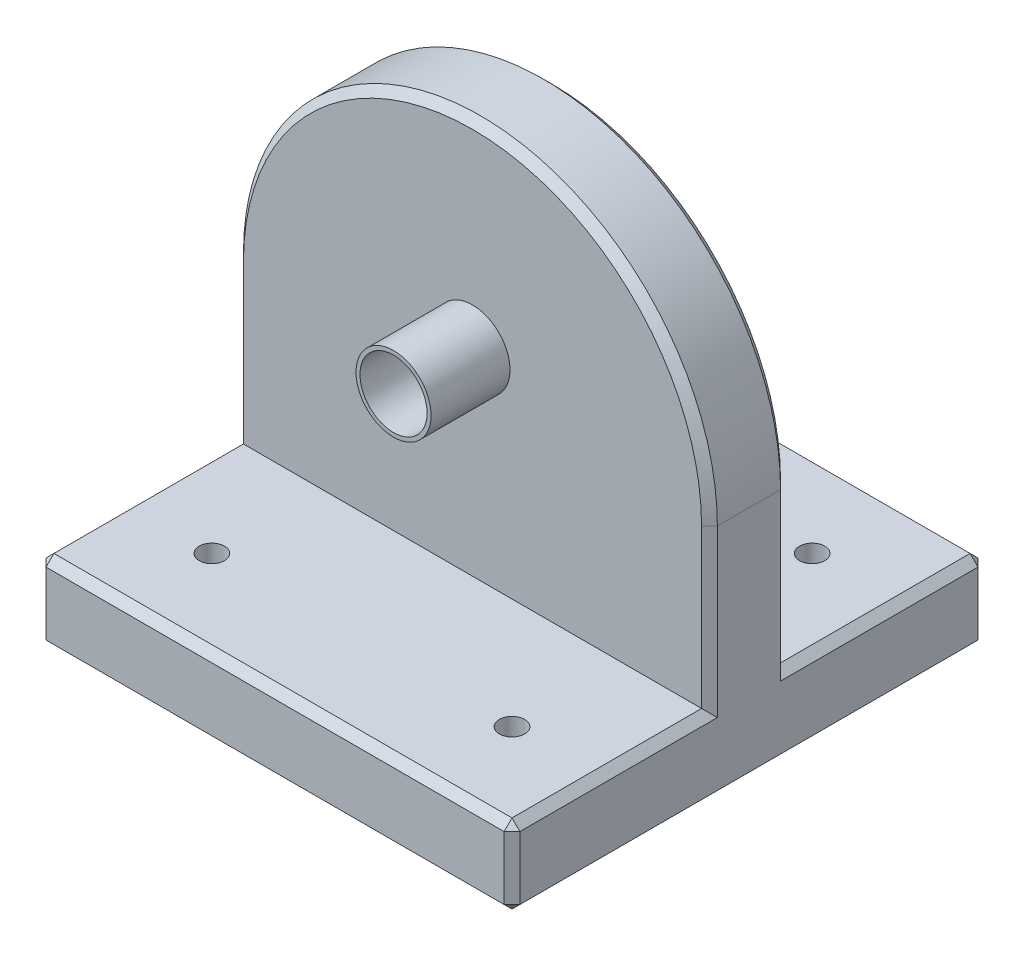
ISO-10303-21;
HEADER;
FILE_DESCRIPTION(('STEP AP214'),'2;1');
FILE_NAME('part.step','',(''),(''),'','','');
FILE_SCHEMA(('AUTOMOTIVE_DESIGN { 1 0 10303 214 1 1 1 1 }'));
ENDSEC;
DATA;
#1=APPLICATION_CONTEXT('core data for automotive mechanical design processes');
#2=APPLICATION_PROTOCOL_DEFINITION('international standard','automotive_design',2000,#1);
#3=PRODUCT_CONTEXT('',#1,'mechanical');
#4=PRODUCT('Part','Part','',(#3));
#5=PRODUCT_RELATED_PRODUCT_CATEGORY('part','',(#4));
#6=PRODUCT_DEFINITION_FORMATION('','',#4);
#7=PRODUCT_DEFINITION_CONTEXT('part definition',#1,'design');
#8=PRODUCT_DEFINITION('design','',#6,#7);
#9=PRODUCT_DEFINITION_SHAPE('','',#8);
#10=(LENGTH_UNIT() NAMED_UNIT(*) SI_UNIT(.MILLI.,.METRE.));
#11=(NAMED_UNIT(*) PLANE_ANGLE_UNIT() SI_UNIT($,.RADIAN.));
#12=(NAMED_UNIT(*) SI_UNIT($,.STERADIAN.) SOLID_ANGLE_UNIT());
#13=UNCERTAINTY_MEASURE_WITH_UNIT(LENGTH_MEASURE(1.E-05),#10,'distance_accuracy_value','');
#14=(GEOMETRIC_REPRESENTATION_CONTEXT(3) GLOBAL_UNCERTAINTY_ASSIGNED_CONTEXT((#13)) GLOBAL_UNIT_ASSIGNED_CONTEXT((#10,
#11,#12)) REPRESENTATION_CONTEXT('',''));
#15=CARTESIAN_POINT('',(0.,0.,0.));
#16=DIRECTION('',(0.,0.,1.));
#17=DIRECTION('',(1.,0.,0.));
#18=AXIS2_PLACEMENT_3D('',#15,#16,#17);
#19=CARTESIAN_POINT('',(0.,-5.,10.));
#20=DIRECTION('',(0.,0.,-1.));
#21=DIRECTION('',(-1.,0.,0.));
#22=AXIS2_PLACEMENT_3D('',#19,#20,#21);
#23=CYLINDRICAL_SURFACE('',#22,30.);
#24=DIRECTION('',(0.,0.,-1.));
#25=VECTOR('',#24,1.);
#26=CARTESIAN_POINT('',(30.,-5.,10.));
#27=LINE('',#26,#25);
#28=CARTESIAN_POINT('',(30.,-5.,1.00000000000001));
#29=VERTEX_POINT('',#28);
#30=CARTESIAN_POINT('',(30.,-5.,9.));
#31=VERTEX_POINT('',#30);
#32=EDGE_CURVE('E482',#29,#31,#27,.F.);
#33=ORIENTED_EDGE('',*,*,#32,.F.);
#34=CARTESIAN_POINT('',(0.,-5.,1.00000000000001));
#35=DIRECTION('',(0.,0.,-1.));
#36=DIRECTION('',(-1.,0.,0.));
#37=AXIS2_PLACEMENT_3D('',#34,#35,#36);
#38=CIRCLE('',#37,30.);
#39=CARTESIAN_POINT('',(-30.,-5.,1.00000000000001));
#40=VERTEX_POINT('',#39);
#41=EDGE_CURVE('E224',#29,#40,#38,.F.);
#42=ORIENTED_EDGE('',*,*,#41,.T.);
#43=DIRECTION('',(0.,0.,-1.));
#44=VECTOR('',#43,1.);
#45=CARTESIAN_POINT('',(-30.,-5.,10.));
#46=LINE('',#45,#44);
#47=CARTESIAN_POINT('',(-30.,-5.,9.));
#48=VERTEX_POINT('',#47);
#49=EDGE_CURVE('E478',#48,#40,#46,.T.);
#50=ORIENTED_EDGE('',*,*,#49,.F.);
#51=CARTESIAN_POINT('',(0.,-5.,9.));
#52=DIRECTION('',(0.,0.,-1.));
#53=DIRECTION('',(-1.,0.,0.));
#54=AXIS2_PLACEMENT_3D('',#51,#52,#53);
#55=CIRCLE('',#54,30.);
#56=EDGE_CURVE('E219',#48,#31,#55,.T.);
#57=ORIENTED_EDGE('',*,*,#56,.T.);
#58=EDGE_LOOP('',(#33,#42,#50,#57));
#59=FACE_BOUND('',#58,.T.);
#60=ADVANCED_FACE('F40',(#59),#23,.T.);
#61=CARTESIAN_POINT('',(0.,0.,10.));
#62=DIRECTION('',(0.,0.,-1.));
#63=DIRECTION('',(-1.,0.,0.));
#64=AXIS2_PLACEMENT_3D('',#61,#62,#63);
#65=PLANE('',#64);
#66=CARTESIAN_POINT('',(0.,-5.,10.));
#67=DIRECTION('',(0.,0.,-1.));
#68=DIRECTION('',(-1.,0.,0.));
#69=AXIS2_PLACEMENT_3D('',#66,#67,#68);
#70=CIRCLE('',#69,29.);
#71=CARTESIAN_POINT('',(29.,-5.,10.));
#72=VERTEX_POINT('',#71);
#73=CARTESIAN_POINT('',(-29.,-5.,10.));
#74=VERTEX_POINT('',#73);
#75=EDGE_CURVE('E235',#72,#74,#70,.F.);
#76=ORIENTED_EDGE('',*,*,#75,.T.);
#77=DIRECTION('',(0.,-1.,0.));
#78=VECTOR('',#77,1.);
#79=CARTESIAN_POINT('',(-29.,0.,10.));
#80=LINE('',#79,#78);
#81=CARTESIAN_POINT('',(-29.,-25.,10.));
#82=VERTEX_POINT('',#81);
#83=EDGE_CURVE('E239',#74,#82,#80,.T.);
#84=ORIENTED_EDGE('',*,*,#83,.T.);
#85=DIRECTION('',(1.,0.,0.));
#86=VECTOR('',#85,1.);
#87=CARTESIAN_POINT('',(-30.,-25.,10.));
#88=LINE('',#87,#86);
#89=CARTESIAN_POINT('',(29.,-25.,10.));
#90=VERTEX_POINT('',#89);
#91=EDGE_CURVE('E201',#82,#90,#88,.T.);
#92=ORIENTED_EDGE('',*,*,#91,.T.);
#93=DIRECTION('',(0.,1.,0.));
#94=VECTOR('',#93,1.);
#95=CARTESIAN_POINT('',(29.,0.,10.));
#96=LINE('',#95,#94);
#97=EDGE_CURVE('E232',#90,#72,#96,.T.);
#98=ORIENTED_EDGE('',*,*,#97,.T.);
#99=EDGE_LOOP('',(#76,#84,#92,#98));
#100=FACE_BOUND('',#99,.T.);
#101=CARTESIAN_POINT('',(0.,0.,10.));
#102=DIRECTION('',(0.,0.,-1.));
#103=DIRECTION('',(-1.,0.,0.));
#104=AXIS2_PLACEMENT_3D('',#101,#102,#103);
#105=CIRCLE('',#104,4.75);
#106=CARTESIAN_POINT('',(-4.75,0.,10.));
#107=VERTEX_POINT('',#106);
#108=EDGE_CURVE('E473',#107,#107,#105,.F.);
#109=ORIENTED_EDGE('',*,*,#108,.F.);
#110=EDGE_LOOP('',(#109));
#111=FACE_BOUND('',#110,.T.);
#112=ADVANCED_FACE('F572',(#100,#111),#65,.F.);
#113=CARTESIAN_POINT('',(30.,-25.,10.));
#114=DIRECTION('',(-1.,0.,0.));
#115=DIRECTION('',(0.,0.,1.));
#116=AXIS2_PLACEMENT_3D('',#113,#114,#115);
#117=PLANE('',#116);
#118=DIRECTION('',(0.,0.,1.));
#119=VECTOR('',#118,1.);
#120=CARTESIAN_POINT('',(30.,-26.,0.));
#121=LINE('',#120,#119);
#122=CARTESIAN_POINT('',(30.,-26.,-24.));
#123=VERTEX_POINT('',#122);
#124=CARTESIAN_POINT('',(30.,-26.,1.00000000000001));
#125=VERTEX_POINT('',#124);
#126=EDGE_CURVE('E316',#123,#125,#121,.T.);
#127=ORIENTED_EDGE('',*,*,#126,.T.);
#128=DIRECTION('',(0.,1.,0.));
#129=VECTOR('',#128,1.);
#130=CARTESIAN_POINT('',(30.,-5.,1.00000000000001));
#131=LINE('',#130,#129);
#132=EDGE_CURVE('E319',#125,#29,#131,.T.);
#133=ORIENTED_EDGE('',*,*,#132,.T.);
#134=ORIENTED_EDGE('',*,*,#32,.T.);
#135=DIRECTION('',(0.,-1.,0.));
#136=VECTOR('',#135,1.);
#137=CARTESIAN_POINT('',(30.,-25.,9.));
#138=LINE('',#137,#136);
#139=CARTESIAN_POINT('',(30.,-26.,9.));
#140=VERTEX_POINT('',#139);
#141=EDGE_CURVE('E307',#31,#140,#138,.T.);
#142=ORIENTED_EDGE('',*,*,#141,.T.);
#143=DIRECTION('',(0.,0.,1.));
#144=VECTOR('',#143,1.);
#145=CARTESIAN_POINT('',(30.,-26.,35.));
#146=LINE('',#145,#144);
#147=CARTESIAN_POINT('',(30.,-26.,34.));
#148=VERTEX_POINT('',#147);
#149=EDGE_CURVE('E304',#140,#148,#146,.T.);
#150=ORIENTED_EDGE('',*,*,#149,.T.);
#151=DIRECTION('',(0.,-1.,0.));
#152=VECTOR('',#151,1.);
#153=CARTESIAN_POINT('',(30.,-25.,34.));
#154=LINE('',#153,#152);
#155=CARTESIAN_POINT('',(30.,-34.,34.));
#156=VERTEX_POINT('',#155);
#157=EDGE_CURVE('E301',#148,#156,#154,.T.);
#158=ORIENTED_EDGE('',*,*,#157,.T.);
#159=DIRECTION('',(0.,0.,-1.));
#160=VECTOR('',#159,1.);
#161=CARTESIAN_POINT('',(30.,-34.,10.));
#162=LINE('',#161,#160);
#163=CARTESIAN_POINT('',(30.,-34.,-24.));
#164=VERTEX_POINT('',#163);
#165=EDGE_CURVE('E310',#156,#164,#162,.T.);
#166=ORIENTED_EDGE('',*,*,#165,.T.);
#167=DIRECTION('',(0.,1.,0.));
#168=VECTOR('',#167,1.);
#169=CARTESIAN_POINT('',(30.,-25.,-24.));
#170=LINE('',#169,#168);
#171=EDGE_CURVE('E313',#164,#123,#170,.T.);
#172=ORIENTED_EDGE('',*,*,#171,.T.);
#173=EDGE_LOOP('',(#127,#133,#134,#142,#150,#158,#166,#172));
#174=FACE_BOUND('',#173,.T.);
#175=ADVANCED_FACE('F488',(#174),#117,.F.);
#176=CARTESIAN_POINT('',(-30.,-25.,10.));
#177=DIRECTION('',(1.,0.,0.));
#178=DIRECTION('',(0.,0.,-1.));
#179=AXIS2_PLACEMENT_3D('',#176,#177,#178);
#180=PLANE('',#179);
#181=ORIENTED_EDGE('',*,*,#49,.T.);
#182=DIRECTION('',(0.,-1.,0.));
#183=VECTOR('',#182,1.);
#184=CARTESIAN_POINT('',(-30.,-25.,1.00000000000001));
#185=LINE('',#184,#183);
#186=CARTESIAN_POINT('',(-30.,-26.,1.00000000000001));
#187=VERTEX_POINT('',#186);
#188=EDGE_CURVE('E259',#40,#187,#185,.T.);
#189=ORIENTED_EDGE('',*,*,#188,.T.);
#190=DIRECTION('',(0.,0.,-1.));
#191=VECTOR('',#190,1.);
#192=CARTESIAN_POINT('',(-30.,-26.,-25.));
#193=LINE('',#192,#191);
#194=CARTESIAN_POINT('',(-30.,-26.,-24.));
#195=VERTEX_POINT('',#194);
#196=EDGE_CURVE('E208',#187,#195,#193,.T.);
#197=ORIENTED_EDGE('',*,*,#196,.T.);
#198=DIRECTION('',(0.,-1.,0.));
#199=VECTOR('',#198,1.);
#200=CARTESIAN_POINT('',(-30.,-25.,-24.));
#201=LINE('',#200,#199);
#202=CARTESIAN_POINT('',(-30.,-34.,-24.));
#203=VERTEX_POINT('',#202);
#204=EDGE_CURVE('E254',#195,#203,#201,.T.);
#205=ORIENTED_EDGE('',*,*,#204,.T.);
#206=DIRECTION('',(0.,0.,1.));
#207=VECTOR('',#206,1.);
#208=CARTESIAN_POINT('',(-30.,-34.,10.));
#209=LINE('',#208,#207);
#210=CARTESIAN_POINT('',(-30.,-34.,34.));
#211=VERTEX_POINT('',#210);
#212=EDGE_CURVE('E245',#203,#211,#209,.T.);
#213=ORIENTED_EDGE('',*,*,#212,.T.);
#214=DIRECTION('',(0.,1.,0.));
#215=VECTOR('',#214,1.);
#216=CARTESIAN_POINT('',(-30.,-25.,34.));
#217=LINE('',#216,#215);
#218=CARTESIAN_POINT('',(-30.,-26.,34.));
#219=VERTEX_POINT('',#218);
#220=EDGE_CURVE('E242',#211,#219,#217,.T.);
#221=ORIENTED_EDGE('',*,*,#220,.T.);
#222=DIRECTION('',(0.,0.,-1.));
#223=VECTOR('',#222,1.);
#224=CARTESIAN_POINT('',(-30.,-26.,10.));
#225=LINE('',#224,#223);
#226=CARTESIAN_POINT('',(-30.,-26.,9.));
#227=VERTEX_POINT('',#226);
#228=EDGE_CURVE('E248',#219,#227,#225,.T.);
#229=ORIENTED_EDGE('',*,*,#228,.T.);
#230=DIRECTION('',(0.,1.,0.));
#231=VECTOR('',#230,1.);
#232=CARTESIAN_POINT('',(-30.,-25.,9.));
#233=LINE('',#232,#231);
#234=EDGE_CURVE('E251',#227,#48,#233,.T.);
#235=ORIENTED_EDGE('',*,*,#234,.T.);
#236=EDGE_LOOP('',(#181,#189,#197,#205,#213,#221,#229,#235));
#237=FACE_BOUND('',#236,.T.);
#238=ADVANCED_FACE('F537',(#237),#180,.F.);
#239=CARTESIAN_POINT('',(0.,0.,0.));
#240=DIRECTION('',(0.,0.,-1.));
#241=DIRECTION('',(-1.,0.,0.));
#242=AXIS2_PLACEMENT_3D('',#239,#240,#241);
#243=PLANE('',#242);
#244=CARTESIAN_POINT('',(0.,0.,0.));
#245=DIRECTION('',(0.,0.,1.));
#246=DIRECTION('',(1.,0.,0.));
#247=AXIS2_PLACEMENT_3D('',#244,#245,#246);
#248=CIRCLE('',#247,4.);
#249=CARTESIAN_POINT('',(4.,0.,0.));
#250=VERTEX_POINT('',#249);
#251=EDGE_CURVE('E202',#250,#250,#248,.T.);
#252=ORIENTED_EDGE('',*,*,#251,.T.);
#253=EDGE_LOOP('',(#252));
#254=FACE_BOUND('',#253,.T.);
#255=DIRECTION('',(1.,0.,0.));
#256=VECTOR('',#255,1.);
#257=CARTESIAN_POINT('',(-30.,-25.,0.));
#258=LINE('',#257,#256);
#259=CARTESIAN_POINT('',(-29.,-25.,0.));
#260=VERTEX_POINT('',#259);
#261=CARTESIAN_POINT('',(29.,-25.,0.));
#262=VERTEX_POINT('',#261);
#263=EDGE_CURVE('E181',#260,#262,#258,.T.);
#264=ORIENTED_EDGE('',*,*,#263,.F.);
#265=DIRECTION('',(0.,1.,0.));
#266=VECTOR('',#265,1.);
#267=CARTESIAN_POINT('',(-29.,-5.,0.));
#268=LINE('',#267,#266);
#269=CARTESIAN_POINT('',(-29.,-5.,0.));
#270=VERTEX_POINT('',#269);
#271=EDGE_CURVE('E196',#260,#270,#268,.T.);
#272=ORIENTED_EDGE('',*,*,#271,.T.);
#273=CARTESIAN_POINT('',(0.,-5.,0.));
#274=DIRECTION('',(0.,0.,-1.));
#275=DIRECTION('',(-1.,0.,0.));
#276=AXIS2_PLACEMENT_3D('',#273,#274,#275);
#277=CIRCLE('',#276,29.);
#278=CARTESIAN_POINT('',(29.,-5.,0.));
#279=VERTEX_POINT('',#278);
#280=EDGE_CURVE('E220',#270,#279,#277,.T.);
#281=ORIENTED_EDGE('',*,*,#280,.T.);
#282=DIRECTION('',(0.,-1.,0.));
#283=VECTOR('',#282,1.);
#284=CARTESIAN_POINT('',(29.,-25.,0.));
#285=LINE('',#284,#283);
#286=EDGE_CURVE('E199',#279,#262,#285,.T.);
#287=ORIENTED_EDGE('',*,*,#286,.T.);
#288=EDGE_LOOP('',(#264,#272,#281,#287));
#289=FACE_BOUND('',#288,.T.);
#290=ADVANCED_FACE('F193',(#254,#289),#243,.T.);
#291=CARTESIAN_POINT('',(0.,0.,10.));
#292=DIRECTION('',(0.,0.,1.));
#293=DIRECTION('',(1.,0.,0.));
#294=AXIS2_PLACEMENT_3D('',#291,#292,#293);
#295=CYLINDRICAL_SURFACE('',#294,4.);
#296=ORIENTED_EDGE('',*,*,#251,.F.);
#297=EDGE_LOOP('',(#296));
#298=FACE_BOUND('',#297,.T.);
#299=CARTESIAN_POINT('',(0.,0.,9.39644660940674));
#300=DIRECTION('',(0.,0.,1.));
#301=DIRECTION('',(1.,0.,0.));
#302=AXIS2_PLACEMENT_3D('',#299,#300,#301);
#303=CIRCLE('',#302,4.);
#304=CARTESIAN_POINT('',(4.,0.,9.39644660940674));
#305=VERTEX_POINT('',#304);
#306=EDGE_CURVE('E464',#305,#305,#303,.T.);
#307=ORIENTED_EDGE('',*,*,#306,.T.);
#308=EDGE_LOOP('',(#307));
#309=FACE_BOUND('',#308,.T.);
#310=ADVANCED_FACE('F768',(#298,#309),#295,.F.);
#311=CARTESIAN_POINT('',(0.,0.,10.));
#312=DIRECTION('',(0.,0.,1.));
#313=DIRECTION('',(1.,0.,0.));
#314=AXIS2_PLACEMENT_3D('',#311,#312,#313);
#315=CONICAL_SURFACE('',#314,4.25,0.392699081698732);
#316=ORIENTED_EDGE('',*,*,#306,.F.);
#317=EDGE_LOOP('',(#316));
#318=FACE_BOUND('',#317,.T.);
#319=CARTESIAN_POINT('',(0.,0.,10.));
#320=DIRECTION('',(0.,0.,1.));
#321=DIRECTION('',(1.,0.,0.));
#322=AXIS2_PLACEMENT_3D('',#319,#320,#321);
#323=CIRCLE('',#322,4.25);
#324=CARTESIAN_POINT('',(4.25,0.,10.));
#325=VERTEX_POINT('',#324);
#326=EDGE_CURVE('E445',#325,#325,#323,.T.);
#327=ORIENTED_EDGE('',*,*,#326,.T.);
#328=EDGE_LOOP('',(#327));
#329=FACE_BOUND('',#328,.T.);
#330=ADVANCED_FACE('F765',(#318,#329),#315,.F.);
#331=CARTESIAN_POINT('',(0.,-25.,0.));
#332=DIRECTION('',(0.,1.,0.));
#333=DIRECTION('',(0.,0.,1.));
#334=AXIS2_PLACEMENT_3D('',#331,#332,#333);
#335=PLANE('',#334);
#336=CARTESIAN_POINT('',(19.,-25.,24.));
#337=DIRECTION('',(0.,1.,0.));
#338=DIRECTION('',(0.,0.,1.));
#339=AXIS2_PLACEMENT_3D('',#336,#337,#338);
#340=CIRCLE('',#339,1.60000000000001);
#341=CARTESIAN_POINT('',(19.,-25.,25.6));
#342=VERTEX_POINT('',#341);
#343=EDGE_CURVE('E1084',#342,#342,#340,.T.);
#344=ORIENTED_EDGE('',*,*,#343,.F.);
#345=EDGE_LOOP('',(#344));
#346=FACE_BOUND('',#345,.T.);
#347=CARTESIAN_POINT('',(-19.,-25.,24.));
#348=DIRECTION('',(0.,1.,0.));
#349=DIRECTION('',(0.,0.,1.));
#350=AXIS2_PLACEMENT_3D('',#347,#348,#349);
#351=CIRCLE('',#350,1.60000000000001);
#352=CARTESIAN_POINT('',(-19.,-25.,25.6));
#353=VERTEX_POINT('',#352);
#354=EDGE_CURVE('E1092',#353,#353,#351,.T.);
#355=ORIENTED_EDGE('',*,*,#354,.F.);
#356=EDGE_LOOP('',(#355));
#357=FACE_BOUND('',#356,.T.);
#358=ORIENTED_EDGE('',*,*,#91,.F.);
#359=DIRECTION('',(0.,0.,1.));
#360=VECTOR('',#359,1.);
#361=CARTESIAN_POINT('',(-29.,-25.,35.));
#362=LINE('',#361,#360);
#363=CARTESIAN_POINT('',(-29.,-25.,34.));
#364=VERTEX_POINT('',#363);
#365=EDGE_CURVE('E268',#82,#364,#362,.T.);
#366=ORIENTED_EDGE('',*,*,#365,.T.);
#367=DIRECTION('',(1.,0.,0.));
#368=VECTOR('',#367,1.);
#369=CARTESIAN_POINT('',(30.,-25.,34.));
#370=LINE('',#369,#368);
#371=CARTESIAN_POINT('',(29.,-25.,34.));
#372=VERTEX_POINT('',#371);
#373=EDGE_CURVE('E262',#364,#372,#370,.T.);
#374=ORIENTED_EDGE('',*,*,#373,.T.);
#375=DIRECTION('',(0.,0.,-1.));
#376=VECTOR('',#375,1.);
#377=CARTESIAN_POINT('',(29.,-25.,10.));
#378=LINE('',#377,#376);
#379=EDGE_CURVE('E265',#372,#90,#378,.T.);
#380=ORIENTED_EDGE('',*,*,#379,.T.);
#381=EDGE_LOOP('',(#358,#366,#374,#380));
#382=FACE_BOUND('',#381,.T.);
#383=ADVANCED_FACE('F548',(#346,#357,#382),#335,.T.);
#384=CARTESIAN_POINT('',(-30.,-35.,35.));
#385=DIRECTION('',(0.,0.,-1.));
#386=DIRECTION('',(-1.,0.,0.));
#387=AXIS2_PLACEMENT_3D('',#384,#385,#386);
#388=PLANE('',#387);
#389=DIRECTION('',(1.,0.,0.));
#390=VECTOR('',#389,1.);
#391=CARTESIAN_POINT('',(-30.,-34.,35.));
#392=LINE('',#391,#390);
#393=CARTESIAN_POINT('',(-29.,-34.,35.));
#394=VERTEX_POINT('',#393);
#395=CARTESIAN_POINT('',(29.,-34.,35.));
#396=VERTEX_POINT('',#395);
#397=EDGE_CURVE('E51',#394,#396,#392,.T.);
#398=ORIENTED_EDGE('',*,*,#397,.T.);
#399=DIRECTION('',(0.,1.,0.));
#400=VECTOR('',#399,1.);
#401=CARTESIAN_POINT('',(29.,-35.,35.));
#402=LINE('',#401,#400);
#403=CARTESIAN_POINT('',(29.,-26.,35.));
#404=VERTEX_POINT('',#403);
#405=EDGE_CURVE('E11',#396,#404,#402,.T.);
#406=ORIENTED_EDGE('',*,*,#405,.T.);
#407=DIRECTION('',(-1.,0.,0.));
#408=VECTOR('',#407,1.);
#409=CARTESIAN_POINT('',(-30.,-26.,35.));
#410=LINE('',#409,#408);
#411=CARTESIAN_POINT('',(-29.,-26.,35.));
#412=VERTEX_POINT('',#411);
#413=EDGE_CURVE('E322',#404,#412,#410,.T.);
#414=ORIENTED_EDGE('',*,*,#413,.T.);
#415=DIRECTION('',(0.,-1.,0.));
#416=VECTOR('',#415,1.);
#417=CARTESIAN_POINT('',(-29.,-35.,35.));
#418=LINE('',#417,#416);
#419=EDGE_CURVE('E62',#412,#394,#418,.T.);
#420=ORIENTED_EDGE('',*,*,#419,.T.);
#421=EDGE_LOOP('',(#398,#406,#414,#420));
#422=FACE_BOUND('',#421,.T.);
#423=ADVANCED_FACE('F761',(#422),#388,.F.);
#424=CARTESIAN_POINT('',(-30.,-35.,-25.));
#425=DIRECTION('',(0.,0.,1.));
#426=DIRECTION('',(1.,0.,0.));
#427=AXIS2_PLACEMENT_3D('',#424,#425,#426);
#428=PLANE('',#427);
#429=DIRECTION('',(-1.,0.,0.));
#430=VECTOR('',#429,1.);
#431=CARTESIAN_POINT('',(-30.,-34.,-25.));
#432=LINE('',#431,#430);
#433=CARTESIAN_POINT('',(29.,-34.,-25.));
#434=VERTEX_POINT('',#433);
#435=CARTESIAN_POINT('',(-29.,-34.,-25.));
#436=VERTEX_POINT('',#435);
#437=EDGE_CURVE('E294',#434,#436,#432,.T.);
#438=ORIENTED_EDGE('',*,*,#437,.T.);
#439=DIRECTION('',(0.,1.,0.));
#440=VECTOR('',#439,1.);
#441=CARTESIAN_POINT('',(-29.,-35.,-25.));
#442=LINE('',#441,#440);
#443=CARTESIAN_POINT('',(-29.,-26.,-25.));
#444=VERTEX_POINT('',#443);
#445=EDGE_CURVE('E297',#436,#444,#442,.T.);
#446=ORIENTED_EDGE('',*,*,#445,.T.);
#447=DIRECTION('',(1.,0.,0.));
#448=VECTOR('',#447,1.);
#449=CARTESIAN_POINT('',(30.,-26.,-25.));
#450=LINE('',#449,#448);
#451=CARTESIAN_POINT('',(29.,-26.,-25.));
#452=VERTEX_POINT('',#451);
#453=EDGE_CURVE('E291',#444,#452,#450,.T.);
#454=ORIENTED_EDGE('',*,*,#453,.T.);
#455=DIRECTION('',(0.,-1.,0.));
#456=VECTOR('',#455,1.);
#457=CARTESIAN_POINT('',(29.,-35.,-25.));
#458=LINE('',#457,#456);
#459=EDGE_CURVE('E190',#452,#434,#458,.T.);
#460=ORIENTED_EDGE('',*,*,#459,.T.);
#461=EDGE_LOOP('',(#438,#446,#454,#460));
#462=FACE_BOUND('',#461,.T.);
#463=ADVANCED_FACE('F754',(#462),#428,.F.);
#464=CARTESIAN_POINT('',(0.,-35.,0.));
#465=DIRECTION('',(0.,1.,0.));
#466=DIRECTION('',(0.,0.,1.));
#467=AXIS2_PLACEMENT_3D('',#464,#465,#466);
#468=PLANE('',#467);
#469=CARTESIAN_POINT('',(-19.,-35.,-14.));
#470=DIRECTION('',(0.,1.,0.));
#471=DIRECTION('',(0.,0.,1.));
#472=AXIS2_PLACEMENT_3D('',#469,#470,#471);
#473=CIRCLE('',#472,1.60000000000001);
#474=CARTESIAN_POINT('',(-19.,-35.,-12.4));
#475=VERTEX_POINT('',#474);
#476=EDGE_CURVE('E1067',#475,#475,#473,.T.);
#477=ORIENTED_EDGE('',*,*,#476,.T.);
#478=EDGE_LOOP('',(#477));
#479=FACE_BOUND('',#478,.T.);
#480=CARTESIAN_POINT('',(19.,-35.,-14.));
#481=DIRECTION('',(0.,1.,0.));
#482=DIRECTION('',(0.,0.,1.));
#483=AXIS2_PLACEMENT_3D('',#480,#481,#482);
#484=CIRCLE('',#483,1.60000000000001);
#485=CARTESIAN_POINT('',(19.,-35.,-12.4));
#486=VERTEX_POINT('',#485);
#487=EDGE_CURVE('E1080',#486,#486,#484,.T.);
#488=ORIENTED_EDGE('',*,*,#487,.T.);
#489=EDGE_LOOP('',(#488));
#490=FACE_BOUND('',#489,.T.);
#491=CARTESIAN_POINT('',(19.,-35.,24.));
#492=DIRECTION('',(0.,1.,0.));
#493=DIRECTION('',(0.,0.,1.));
#494=AXIS2_PLACEMENT_3D('',#491,#492,#493);
#495=CIRCLE('',#494,1.60000000000001);
#496=CARTESIAN_POINT('',(19.,-35.,25.6));
#497=VERTEX_POINT('',#496);
#498=EDGE_CURVE('E1088',#497,#497,#495,.T.);
#499=ORIENTED_EDGE('',*,*,#498,.T.);
#500=EDGE_LOOP('',(#499));
#501=FACE_BOUND('',#500,.T.);
#502=CARTESIAN_POINT('',(-19.,-35.,24.));
#503=DIRECTION('',(0.,1.,0.));
#504=DIRECTION('',(0.,0.,1.));
#505=AXIS2_PLACEMENT_3D('',#502,#503,#504);
#506=CIRCLE('',#505,1.60000000000001);
#507=CARTESIAN_POINT('',(-19.,-35.,25.6));
#508=VERTEX_POINT('',#507);
#509=EDGE_CURVE('E332',#508,#508,#506,.T.);
#510=ORIENTED_EDGE('',*,*,#509,.T.);
#511=EDGE_LOOP('',(#510));
#512=FACE_BOUND('',#511,.T.);
#513=DIRECTION('',(-1.,0.,0.));
#514=VECTOR('',#513,1.);
#515=CARTESIAN_POINT('',(0.,-35.,34.));
#516=LINE('',#515,#514);
#517=CARTESIAN_POINT('',(29.,-35.,34.));
#518=VERTEX_POINT('',#517);
#519=CARTESIAN_POINT('',(-29.,-35.,34.));
#520=VERTEX_POINT('',#519);
#521=EDGE_CURVE('E271',#518,#520,#516,.T.);
#522=ORIENTED_EDGE('',*,*,#521,.T.);
#523=DIRECTION('',(0.,0.,-1.));
#524=VECTOR('',#523,1.);
#525=CARTESIAN_POINT('',(-29.,-35.,0.));
#526=LINE('',#525,#524);
#527=CARTESIAN_POINT('',(-29.,-35.,-24.));
#528=VERTEX_POINT('',#527);
#529=EDGE_CURVE('E280',#520,#528,#526,.T.);
#530=ORIENTED_EDGE('',*,*,#529,.T.);
#531=DIRECTION('',(1.,0.,0.));
#532=VECTOR('',#531,1.);
#533=CARTESIAN_POINT('',(0.,-35.,-24.));
#534=LINE('',#533,#532);
#535=CARTESIAN_POINT('',(29.,-35.,-24.));
#536=VERTEX_POINT('',#535);
#537=EDGE_CURVE('E277',#528,#536,#534,.T.);
#538=ORIENTED_EDGE('',*,*,#537,.T.);
#539=DIRECTION('',(0.,0.,1.));
#540=VECTOR('',#539,1.);
#541=CARTESIAN_POINT('',(29.,-35.,0.));
#542=LINE('',#541,#540);
#543=EDGE_CURVE('E274',#536,#518,#542,.T.);
#544=ORIENTED_EDGE('',*,*,#543,.T.);
#545=EDGE_LOOP('',(#522,#530,#538,#544));
#546=FACE_BOUND('',#545,.T.);
#547=ADVANCED_FACE('F751',(#479,#490,#501,#512,#546),#468,.F.);
#548=CARTESIAN_POINT('',(-19.,-25.,-14.));
#549=DIRECTION('',(0.,1.,0.));
#550=DIRECTION('',(0.,0.,1.));
#551=AXIS2_PLACEMENT_3D('',#548,#549,#550);
#552=CIRCLE('',#551,1.60000000000001);
#553=CARTESIAN_POINT('',(-19.,-25.,-12.4));
#554=VERTEX_POINT('',#553);
#555=EDGE_CURVE('E1070',#554,#554,#552,.T.);
#556=ORIENTED_EDGE('',*,*,#555,.F.);
#557=EDGE_LOOP('',(#556));
#558=FACE_BOUND('',#557,.T.);
#559=CARTESIAN_POINT('',(19.,-25.,-14.));
#560=DIRECTION('',(0.,1.,0.));
#561=DIRECTION('',(0.,0.,1.));
#562=AXIS2_PLACEMENT_3D('',#559,#560,#561);
#563=CIRCLE('',#562,1.60000000000001);
#564=CARTESIAN_POINT('',(19.,-25.,-12.4));
#565=VERTEX_POINT('',#564);
#566=EDGE_CURVE('E1074',#565,#565,#563,.T.);
#567=ORIENTED_EDGE('',*,*,#566,.F.);
#568=EDGE_LOOP('',(#567));
#569=FACE_BOUND('',#568,.T.);
#570=DIRECTION('',(-1.,0.,0.));
#571=VECTOR('',#570,1.);
#572=CARTESIAN_POINT('',(-30.,-25.,-24.));
#573=LINE('',#572,#571);
#574=CARTESIAN_POINT('',(29.,-25.,-24.));
#575=VERTEX_POINT('',#574);
#576=CARTESIAN_POINT('',(-29.,-25.,-24.));
#577=VERTEX_POINT('',#576);
#578=EDGE_CURVE('E184',#575,#577,#573,.T.);
#579=ORIENTED_EDGE('',*,*,#578,.T.);
#580=DIRECTION('',(0.,0.,1.));
#581=VECTOR('',#580,1.);
#582=CARTESIAN_POINT('',(-29.,-25.,0.));
#583=LINE('',#582,#581);
#584=EDGE_CURVE('E178',#577,#260,#583,.T.);
#585=ORIENTED_EDGE('',*,*,#584,.T.);
#586=ORIENTED_EDGE('',*,*,#263,.T.);
#587=DIRECTION('',(0.,0.,-1.));
#588=VECTOR('',#587,1.);
#589=CARTESIAN_POINT('',(29.,-25.,-25.));
#590=LINE('',#589,#588);
#591=EDGE_CURVE('E284',#262,#575,#590,.T.);
#592=ORIENTED_EDGE('',*,*,#591,.T.);
#593=EDGE_LOOP('',(#579,#585,#586,#592));
#594=FACE_BOUND('',#593,.T.);
#595=ADVANCED_FACE('F180',(#558,#569,#594),#335,.T.);
#596=CARTESIAN_POINT('',(0.,0.,20.));
#597=DIRECTION('',(0.,0.,1.));
#598=DIRECTION('',(1.,0.,0.));
#599=AXIS2_PLACEMENT_3D('',#596,#597,#598);
#600=PLANE('',#599);
#601=CARTESIAN_POINT('',(0.,0.,20.));
#602=DIRECTION('',(0.,0.,1.));
#603=DIRECTION('',(1.,0.,0.));
#604=AXIS2_PLACEMENT_3D('',#601,#602,#603);
#605=CIRCLE('',#604,4.75);
#606=CARTESIAN_POINT('',(4.75,0.,20.));
#607=VERTEX_POINT('',#606);
#608=EDGE_CURVE('E457',#607,#607,#605,.T.);
#609=ORIENTED_EDGE('',*,*,#608,.T.);
#610=EDGE_LOOP('',(#609));
#611=FACE_BOUND('',#610,.T.);
#612=CARTESIAN_POINT('',(0.,0.,20.));
#613=DIRECTION('',(0.,0.,1.));
#614=DIRECTION('',(1.,0.,0.));
#615=AXIS2_PLACEMENT_3D('',#612,#613,#614);
#616=CIRCLE('',#615,4.25);
#617=CARTESIAN_POINT('',(4.25,0.,20.));
#618=VERTEX_POINT('',#617);
#619=EDGE_CURVE('E451',#618,#618,#616,.T.);
#620=ORIENTED_EDGE('',*,*,#619,.F.);
#621=EDGE_LOOP('',(#620));
#622=FACE_BOUND('',#621,.T.);
#623=ADVANCED_FACE('F741',(#611,#622),#600,.T.);
#624=CARTESIAN_POINT('',(0.,0.,20.));
#625=DIRECTION('',(0.,0.,-1.));
#626=DIRECTION('',(-1.,0.,0.));
#627=AXIS2_PLACEMENT_3D('',#624,#625,#626);
#628=CYLINDRICAL_SURFACE('',#627,4.75);
#629=ORIENTED_EDGE('',*,*,#608,.F.);
#630=EDGE_LOOP('',(#629));
#631=FACE_BOUND('',#630,.T.);
#632=ORIENTED_EDGE('',*,*,#108,.T.);
#633=EDGE_LOOP('',(#632));
#634=FACE_BOUND('',#633,.T.);
#635=ADVANCED_FACE('F735',(#631,#634),#628,.T.);
#636=CARTESIAN_POINT('',(0.,0.,20.));
#637=DIRECTION('',(0.,0.,-1.));
#638=DIRECTION('',(-1.,0.,0.));
#639=AXIS2_PLACEMENT_3D('',#636,#637,#638);
#640=CYLINDRICAL_SURFACE('',#639,4.25);
#641=ORIENTED_EDGE('',*,*,#619,.T.);
#642=EDGE_LOOP('',(#641));
#643=FACE_BOUND('',#642,.T.);
#644=ORIENTED_EDGE('',*,*,#326,.F.);
#645=EDGE_LOOP('',(#644));
#646=FACE_BOUND('',#645,.T.);
#647=ADVANCED_FACE('F731',(#643,#646),#640,.F.);
#648=CARTESIAN_POINT('',(0.,-5.,10.));
#649=DIRECTION('',(0.,0.,-1.));
#650=DIRECTION('',(-1.,0.,0.));
#651=AXIS2_PLACEMENT_3D('',#648,#649,#650);
#652=CONICAL_SURFACE('',#651,29.,0.785398163397455);
#653=DIRECTION('',(-0.707106781186552,0.,0.707106781186542));
#654=VECTOR('',#653,1.);
#655=CARTESIAN_POINT('',(30.,-5.,9.));
#656=LINE('',#655,#654);
#657=EDGE_CURVE('E436',#31,#72,#656,.T.);
#658=ORIENTED_EDGE('',*,*,#657,.F.);
#659=ORIENTED_EDGE('',*,*,#56,.F.);
#660=DIRECTION('',(-0.707106781186552,0.,-0.707106781186542));
#661=VECTOR('',#660,1.);
#662=CARTESIAN_POINT('',(-29.,-5.,10.));
#663=LINE('',#662,#661);
#664=EDGE_CURVE('E45',#74,#48,#663,.T.);
#665=ORIENTED_EDGE('',*,*,#664,.F.);
#666=ORIENTED_EDGE('',*,*,#75,.F.);
#667=EDGE_LOOP('',(#658,#659,#665,#666));
#668=FACE_BOUND('',#667,.T.);
#669=ADVANCED_FACE('F43',(#668),#652,.T.);
#670=CARTESIAN_POINT('',(-29.,0.,10.));
#671=DIRECTION('',(0.707106781186542,0.,-0.707106781186552));
#672=DIRECTION('',(0.,-1.,0.));
#673=AXIS2_PLACEMENT_3D('',#670,#671,#672);
#674=PLANE('',#673);
#675=ORIENTED_EDGE('',*,*,#664,.T.);
#676=ORIENTED_EDGE('',*,*,#234,.F.);
#677=DIRECTION('',(0.577350269189626,0.577350269189634,0.577350269189618));
#678=VECTOR('',#677,1.);
#679=CARTESIAN_POINT('',(-20.6666666666665,-16.6666666666664,18.3333333333333));
#680=LINE('',#679,#678);
#681=EDGE_CURVE('E433',#82,#227,#680,.F.);
#682=ORIENTED_EDGE('',*,*,#681,.F.);
#683=ORIENTED_EDGE('',*,*,#83,.F.);
#684=EDGE_LOOP('',(#675,#676,#682,#683));
#685=FACE_BOUND('',#684,.T.);
#686=ADVANCED_FACE('F540',(#685),#674,.F.);
#687=CARTESIAN_POINT('',(29.,0.,10.));
#688=DIRECTION('',(-0.707106781186542,0.,-0.707106781186552));
#689=DIRECTION('',(0.,1.,0.));
#690=AXIS2_PLACEMENT_3D('',#687,#688,#689);
#691=PLANE('',#690);
#692=ORIENTED_EDGE('',*,*,#657,.T.);
#693=ORIENTED_EDGE('',*,*,#97,.F.);
#694=DIRECTION('',(0.577350269189626,-0.577350269189634,-0.577350269189618));
#695=VECTOR('',#694,1.);
#696=CARTESIAN_POINT('',(20.6666666666665,-16.6666666666664,18.3333333333333));
#697=LINE('',#696,#695);
#698=EDGE_CURVE('E429',#140,#90,#697,.F.);
#699=ORIENTED_EDGE('',*,*,#698,.F.);
#700=ORIENTED_EDGE('',*,*,#141,.F.);
#701=EDGE_LOOP('',(#692,#693,#699,#700));
#702=FACE_BOUND('',#701,.T.);
#703=ADVANCED_FACE('F496',(#702),#691,.F.);
#704=CARTESIAN_POINT('',(-30.,-26.,10.));
#705=DIRECTION('',(-0.707106781186552,0.707106781186542,0.));
#706=DIRECTION('',(0.,0.,1.));
#707=AXIS2_PLACEMENT_3D('',#704,#705,#706);
#708=PLANE('',#707);
#709=ORIENTED_EDGE('',*,*,#681,.T.);
#710=ORIENTED_EDGE('',*,*,#228,.F.);
#711=DIRECTION('',(-0.707106781186543,-0.707106781186552,0.));
#712=VECTOR('',#711,1.);
#713=CARTESIAN_POINT('',(-29.,-25.,34.));
#714=LINE('',#713,#712);
#715=EDGE_CURVE('E425',#364,#219,#714,.T.);
#716=ORIENTED_EDGE('',*,*,#715,.F.);
#717=ORIENTED_EDGE('',*,*,#365,.F.);
#718=EDGE_LOOP('',(#709,#710,#716,#717));
#719=FACE_BOUND('',#718,.T.);
#720=ADVANCED_FACE('F543',(#719),#708,.T.);
#721=CARTESIAN_POINT('',(-30.,-26.,35.));
#722=DIRECTION('',(0.,0.707106781186542,0.707106781186552));
#723=DIRECTION('',(1.,0.,0.));
#724=AXIS2_PLACEMENT_3D('',#721,#722,#723);
#725=PLANE('',#724);
#726=DIRECTION('',(0.,-0.707106781186552,0.707106781186543));
#727=VECTOR('',#726,1.);
#728=CARTESIAN_POINT('',(29.,-25.5,34.5));
#729=LINE('',#728,#727);
#730=EDGE_CURVE('E417',#372,#404,#729,.T.);
#731=ORIENTED_EDGE('',*,*,#730,.F.);
#732=ORIENTED_EDGE('',*,*,#373,.F.);
#733=DIRECTION('',(0.,0.707106781186552,-0.707106781186543));
#734=VECTOR('',#733,1.);
#735=CARTESIAN_POINT('',(-29.,-25.,34.));
#736=LINE('',#735,#734);
#737=EDGE_CURVE('E421',#412,#364,#736,.T.);
#738=ORIENTED_EDGE('',*,*,#737,.F.);
#739=ORIENTED_EDGE('',*,*,#413,.F.);
#740=EDGE_LOOP('',(#731,#732,#738,#739));
#741=FACE_BOUND('',#740,.T.);
#742=ADVANCED_FACE('F552',(#741),#725,.T.);
#743=CARTESIAN_POINT('',(30.,-26.,10.));
#744=DIRECTION('',(0.707106781186552,0.707106781186542,0.));
#745=DIRECTION('',(0.,0.,-1.));
#746=AXIS2_PLACEMENT_3D('',#743,#744,#745);
#747=PLANE('',#746);
#748=ORIENTED_EDGE('',*,*,#698,.T.);
#749=ORIENTED_EDGE('',*,*,#379,.F.);
#750=DIRECTION('',(-0.707106781186543,0.707106781186552,0.));
#751=VECTOR('',#750,1.);
#752=CARTESIAN_POINT('',(30.,-26.,34.));
#753=LINE('',#752,#751);
#754=EDGE_CURVE('E413',#148,#372,#753,.T.);
#755=ORIENTED_EDGE('',*,*,#754,.F.);
#756=ORIENTED_EDGE('',*,*,#149,.F.);
#757=EDGE_LOOP('',(#748,#749,#755,#756));
#758=FACE_BOUND('',#757,.T.);
#759=ADVANCED_FACE('F501',(#758),#747,.T.);
#760=CARTESIAN_POINT('',(-29.,-25.,34.));
#761=DIRECTION('',(-0.577350269189626,0.577350269189618,0.577350269189634));
#762=DIRECTION('',(0.707106781186552,0.,0.707106781186543));
#763=AXIS2_PLACEMENT_3D('',#760,#761,#762);
#764=PLANE('',#763);
#765=ORIENTED_EDGE('',*,*,#737,.T.);
#766=ORIENTED_EDGE('',*,*,#715,.T.);
#767=DIRECTION('',(-0.707106781186552,0.,-0.707106781186543));
#768=VECTOR('',#767,1.);
#769=CARTESIAN_POINT('',(-29.5,-26.,34.5));
#770=LINE('',#769,#768);
#771=EDGE_CURVE('E409',#412,#219,#770,.T.);
#772=ORIENTED_EDGE('',*,*,#771,.F.);
#773=EDGE_LOOP('',(#765,#766,#772));
#774=FACE_BOUND('',#773,.T.);
#775=ADVANCED_FACE('F559',(#774),#764,.T.);
#776=CARTESIAN_POINT('',(30.,-26.,34.));
#777=DIRECTION('',(0.577350269189626,0.577350269189618,0.577350269189632));
#778=DIRECTION('',(0.707106781186551,0.,-0.707106781186544));
#779=AXIS2_PLACEMENT_3D('',#776,#777,#778);
#780=PLANE('',#779);
#781=ORIENTED_EDGE('',*,*,#754,.T.);
#782=ORIENTED_EDGE('',*,*,#730,.T.);
#783=DIRECTION('',(-0.707106781186551,0.,0.707106781186544));
#784=VECTOR('',#783,1.);
#785=CARTESIAN_POINT('',(30.,-26.,34.));
#786=LINE('',#785,#784);
#787=EDGE_CURVE('E406',#148,#404,#786,.T.);
#788=ORIENTED_EDGE('',*,*,#787,.F.);
#789=EDGE_LOOP('',(#781,#782,#788));
#790=FACE_BOUND('',#789,.T.);
#791=ADVANCED_FACE('F556',(#790),#780,.T.);
#792=CARTESIAN_POINT('',(-30.,-25.,34.));
#793=DIRECTION('',(0.707106781186542,0.,-0.707106781186552));
#794=DIRECTION('',(0.,1.,0.));
#795=AXIS2_PLACEMENT_3D('',#792,#793,#794);
#796=PLANE('',#795);
#797=ORIENTED_EDGE('',*,*,#771,.T.);
#798=ORIENTED_EDGE('',*,*,#220,.F.);
#799=DIRECTION('',(0.707106781186552,0.,0.707106781186543));
#800=VECTOR('',#799,1.);
#801=CARTESIAN_POINT('',(-30.,-34.,34.));
#802=LINE('',#801,#800);
#803=EDGE_CURVE('E402',#394,#211,#802,.F.);
#804=ORIENTED_EDGE('',*,*,#803,.F.);
#805=ORIENTED_EDGE('',*,*,#419,.F.);
#806=EDGE_LOOP('',(#797,#798,#804,#805));
#807=FACE_BOUND('',#806,.T.);
#808=ADVANCED_FACE('F558',(#807),#796,.F.);
#809=CARTESIAN_POINT('',(0.,-35.,34.));
#810=DIRECTION('',(0.,0.707106781186542,-0.707106781186552));
#811=DIRECTION('',(-1.,0.,0.));
#812=AXIS2_PLACEMENT_3D('',#809,#810,#811);
#813=PLANE('',#812);
#814=DIRECTION('',(0.,0.707106781186552,0.707106781186542));
#815=VECTOR('',#814,1.);
#816=CARTESIAN_POINT('',(29.,-35.,34.));
#817=LINE('',#816,#815);
#818=EDGE_CURVE('E394',#396,#518,#817,.F.);
#819=ORIENTED_EDGE('',*,*,#818,.F.);
#820=ORIENTED_EDGE('',*,*,#397,.F.);
#821=DIRECTION('',(0.,-0.707106781186552,-0.707106781186543));
#822=VECTOR('',#821,1.);
#823=CARTESIAN_POINT('',(-29.,-34.5,34.5));
#824=LINE('',#823,#822);
#825=EDGE_CURVE('E398',#520,#394,#824,.F.);
#826=ORIENTED_EDGE('',*,*,#825,.F.);
#827=ORIENTED_EDGE('',*,*,#521,.F.);
#828=EDGE_LOOP('',(#819,#820,#826,#827));
#829=FACE_BOUND('',#828,.T.);
#830=ADVANCED_FACE('F565',(#829),#813,.F.);
#831=CARTESIAN_POINT('',(29.,-35.,35.));
#832=DIRECTION('',(-0.707106781186544,0.,-0.707106781186551));
#833=DIRECTION('',(0.,1.,0.));
#834=AXIS2_PLACEMENT_3D('',#831,#832,#833);
#835=PLANE('',#834);
#836=ORIENTED_EDGE('',*,*,#787,.T.);
#837=ORIENTED_EDGE('',*,*,#405,.F.);
#838=DIRECTION('',(0.707106781186551,0.,-0.707106781186544));
#839=VECTOR('',#838,1.);
#840=CARTESIAN_POINT('',(29.5,-34.,34.5));
#841=LINE('',#840,#839);
#842=EDGE_CURVE('E390',#156,#396,#841,.F.);
#843=ORIENTED_EDGE('',*,*,#842,.F.);
#844=ORIENTED_EDGE('',*,*,#157,.F.);
#845=EDGE_LOOP('',(#836,#837,#843,#844));
#846=FACE_BOUND('',#845,.T.);
#847=ADVANCED_FACE('F509',(#846),#835,.F.);
#848=CARTESIAN_POINT('',(-30.,-34.,34.));
#849=DIRECTION('',(-0.577350269189618,-0.577350269189626,0.577350269189634));
#850=DIRECTION('',(0.,-0.707106781186552,-0.707106781186543));
#851=AXIS2_PLACEMENT_3D('',#848,#849,#850);
#852=PLANE('',#851);
#853=ORIENTED_EDGE('',*,*,#825,.T.);
#854=ORIENTED_EDGE('',*,*,#803,.T.);
#855=DIRECTION('',(-0.707106781186552,0.707106781186543,0.));
#856=VECTOR('',#855,1.);
#857=CARTESIAN_POINT('',(-30.,-34.,34.));
#858=LINE('',#857,#856);
#859=EDGE_CURVE('E386',#520,#211,#858,.T.);
#860=ORIENTED_EDGE('',*,*,#859,.F.);
#861=EDGE_LOOP('',(#853,#854,#860));
#862=FACE_BOUND('',#861,.T.);
#863=ADVANCED_FACE('F681',(#862),#852,.T.);
#864=CARTESIAN_POINT('',(29.,-35.,34.));
#865=DIRECTION('',(0.577350269189618,-0.577350269189626,0.577350269189633));
#866=DIRECTION('',(0.,-0.707106781186551,-0.707106781186544));
#867=AXIS2_PLACEMENT_3D('',#864,#865,#866);
#868=PLANE('',#867);
#869=ORIENTED_EDGE('',*,*,#842,.T.);
#870=ORIENTED_EDGE('',*,*,#818,.T.);
#871=DIRECTION('',(-0.707106781186552,-0.707106781186543,0.));
#872=VECTOR('',#871,1.);
#873=CARTESIAN_POINT('',(29.,-35.,34.));
#874=LINE('',#873,#872);
#875=EDGE_CURVE('E382',#156,#518,#874,.T.);
#876=ORIENTED_EDGE('',*,*,#875,.F.);
#877=EDGE_LOOP('',(#869,#870,#876));
#878=FACE_BOUND('',#877,.T.);
#879=ADVANCED_FACE('F512',(#878),#868,.T.);
#880=CARTESIAN_POINT('',(-29.,-35.,0.));
#881=DIRECTION('',(0.707106781186542,0.707106781186552,0.));
#882=DIRECTION('',(0.,0.,-1.));
#883=AXIS2_PLACEMENT_3D('',#880,#881,#882);
#884=PLANE('',#883);
#885=ORIENTED_EDGE('',*,*,#859,.T.);
#886=ORIENTED_EDGE('',*,*,#212,.F.);
#887=DIRECTION('',(0.707106781186552,-0.707106781186542,0.));
#888=VECTOR('',#887,1.);
#889=CARTESIAN_POINT('',(-29.,-35.,-24.));
#890=LINE('',#889,#888);
#891=EDGE_CURVE('E378',#528,#203,#890,.F.);
#892=ORIENTED_EDGE('',*,*,#891,.F.);
#893=ORIENTED_EDGE('',*,*,#529,.F.);
#894=EDGE_LOOP('',(#885,#886,#892,#893));
#895=FACE_BOUND('',#894,.T.);
#896=ADVANCED_FACE('F668',(#895),#884,.F.);
#897=CARTESIAN_POINT('',(0.,-35.,-24.));
#898=DIRECTION('',(0.,0.707106781186552,0.707106781186542));
#899=DIRECTION('',(1.,0.,0.));
#900=AXIS2_PLACEMENT_3D('',#897,#898,#899);
#901=PLANE('',#900);
#902=DIRECTION('',(0.,-0.707106781186543,0.707106781186552));
#903=VECTOR('',#902,1.);
#904=CARTESIAN_POINT('',(29.,-35.,-24.));
#905=LINE('',#904,#903);
#906=EDGE_CURVE('E371',#536,#434,#905,.F.);
#907=ORIENTED_EDGE('',*,*,#906,.F.);
#908=ORIENTED_EDGE('',*,*,#537,.F.);
#909=DIRECTION('',(0.,0.707106781186543,-0.707106781186552));
#910=VECTOR('',#909,1.);
#911=CARTESIAN_POINT('',(-29.,-35.,-24.));
#912=LINE('',#911,#910);
#913=EDGE_CURVE('E375',#436,#528,#912,.F.);
#914=ORIENTED_EDGE('',*,*,#913,.F.);
#915=ORIENTED_EDGE('',*,*,#437,.F.);
#916=EDGE_LOOP('',(#907,#908,#914,#915));
#917=FACE_BOUND('',#916,.T.);
#918=ADVANCED_FACE('F662',(#917),#901,.F.);
#919=CARTESIAN_POINT('',(29.,-35.,0.));
#920=DIRECTION('',(-0.707106781186542,0.707106781186552,0.));
#921=DIRECTION('',(0.,0.,1.));
#922=AXIS2_PLACEMENT_3D('',#919,#920,#921);
#923=PLANE('',#922);
#924=ORIENTED_EDGE('',*,*,#875,.T.);
#925=ORIENTED_EDGE('',*,*,#543,.F.);
#926=DIRECTION('',(0.707106781186552,0.707106781186543,0.));
#927=VECTOR('',#926,1.);
#928=CARTESIAN_POINT('',(29.,-35.,-24.));
#929=LINE('',#928,#927);
#930=EDGE_CURVE('E367',#164,#536,#929,.F.);
#931=ORIENTED_EDGE('',*,*,#930,.F.);
#932=ORIENTED_EDGE('',*,*,#165,.F.);
#933=EDGE_LOOP('',(#924,#925,#931,#932));
#934=FACE_BOUND('',#933,.T.);
#935=ADVANCED_FACE('F515',(#934),#923,.F.);
#936=CARTESIAN_POINT('',(-29.,-35.,-24.));
#937=DIRECTION('',(-0.577350269189619,-0.577350269189633,-0.577350269189625));
#938=DIRECTION('',(0.,0.707106781186543,-0.707106781186552));
#939=AXIS2_PLACEMENT_3D('',#936,#937,#938);
#940=PLANE('',#939);
#941=ORIENTED_EDGE('',*,*,#913,.T.);
#942=ORIENTED_EDGE('',*,*,#891,.T.);
#943=DIRECTION('',(-0.707106781186551,0.,0.707106781186544));
#944=VECTOR('',#943,1.);
#945=CARTESIAN_POINT('',(-29.5,-34.,-24.5));
#946=LINE('',#945,#944);
#947=EDGE_CURVE('E363',#436,#203,#946,.T.);
#948=ORIENTED_EDGE('',*,*,#947,.F.);
#949=EDGE_LOOP('',(#941,#942,#948));
#950=FACE_BOUND('',#949,.T.);
#951=ADVANCED_FACE('F650',(#950),#940,.T.);
#952=CARTESIAN_POINT('',(29.,-35.,-24.));
#953=DIRECTION('',(0.577350269189628,-0.577350269189634,-0.577350269189616));
#954=DIRECTION('',(0.707106781186551,0.707106781186544,0.));
#955=AXIS2_PLACEMENT_3D('',#952,#953,#954);
#956=PLANE('',#955);
#957=ORIENTED_EDGE('',*,*,#930,.T.);
#958=ORIENTED_EDGE('',*,*,#906,.T.);
#959=DIRECTION('',(-0.70710678118654,0.,-0.707106781186555));
#960=VECTOR('',#959,1.);
#961=CARTESIAN_POINT('',(29.5,-34.,-24.5));
#962=LINE('',#961,#960);
#963=EDGE_CURVE('E359',#164,#434,#962,.T.);
#964=ORIENTED_EDGE('',*,*,#963,.F.);
#965=EDGE_LOOP('',(#957,#958,#964));
#966=FACE_BOUND('',#965,.T.);
#967=ADVANCED_FACE('F520',(#966),#956,.T.);
#968=CARTESIAN_POINT('',(-29.,-35.,-25.));
#969=DIRECTION('',(0.707106781186544,0.,0.707106781186551));
#970=DIRECTION('',(0.,1.,0.));
#971=AXIS2_PLACEMENT_3D('',#968,#969,#970);
#972=PLANE('',#971);
#973=ORIENTED_EDGE('',*,*,#947,.T.);
#974=ORIENTED_EDGE('',*,*,#204,.F.);
#975=DIRECTION('',(0.707106781186551,0.,-0.707106781186544));
#976=VECTOR('',#975,1.);
#977=CARTESIAN_POINT('',(-30.,-26.,-24.));
#978=LINE('',#977,#976);
#979=EDGE_CURVE('E355',#444,#195,#978,.F.);
#980=ORIENTED_EDGE('',*,*,#979,.F.);
#981=ORIENTED_EDGE('',*,*,#445,.F.);
#982=EDGE_LOOP('',(#973,#974,#980,#981));
#983=FACE_BOUND('',#982,.T.);
#984=ADVANCED_FACE('F637',(#983),#972,.F.);
#985=CARTESIAN_POINT('',(-30.,-26.,-25.));
#986=DIRECTION('',(0.,0.707106781186542,-0.707106781186552));
#987=DIRECTION('',(-1.,0.,0.));
#988=AXIS2_PLACEMENT_3D('',#985,#986,#987);
#989=PLANE('',#988);
#990=DIRECTION('',(0.,0.707106781186553,0.707106781186543));
#991=VECTOR('',#990,1.);
#992=CARTESIAN_POINT('',(29.,-26.,-25.));
#993=LINE('',#992,#991);
#994=EDGE_CURVE('E348',#452,#575,#993,.T.);
#995=ORIENTED_EDGE('',*,*,#994,.F.);
#996=ORIENTED_EDGE('',*,*,#453,.F.);
#997=DIRECTION('',(0.,-0.707106781186552,-0.707106781186543));
#998=VECTOR('',#997,1.);
#999=CARTESIAN_POINT('',(-29.,-25.5,-24.5));
#1000=LINE('',#999,#998);
#1001=EDGE_CURVE('E352',#577,#444,#1000,.T.);
#1002=ORIENTED_EDGE('',*,*,#1001,.F.);
#1003=ORIENTED_EDGE('',*,*,#578,.F.);
#1004=EDGE_LOOP('',(#995,#996,#1002,#1003));
#1005=FACE_BOUND('',#1004,.T.);
#1006=ADVANCED_FACE('F631',(#1005),#989,.T.);
#1007=CARTESIAN_POINT('',(30.,-25.,-24.));
#1008=DIRECTION('',(-0.707106781186555,0.,0.70710678118654));
#1009=DIRECTION('',(0.,1.,0.));
#1010=AXIS2_PLACEMENT_3D('',#1007,#1008,#1009);
#1011=PLANE('',#1010);
#1012=ORIENTED_EDGE('',*,*,#963,.T.);
#1013=ORIENTED_EDGE('',*,*,#459,.F.);
#1014=DIRECTION('',(0.70710678118654,0.,0.707106781186555));
#1015=VECTOR('',#1014,1.);
#1016=CARTESIAN_POINT('',(29.,-26.,-25.));
#1017=LINE('',#1016,#1015);
#1018=EDGE_CURVE('E344',#123,#452,#1017,.F.);
#1019=ORIENTED_EDGE('',*,*,#1018,.F.);
#1020=ORIENTED_EDGE('',*,*,#171,.F.);
#1021=EDGE_LOOP('',(#1012,#1013,#1019,#1020));
#1022=FACE_BOUND('',#1021,.T.);
#1023=ADVANCED_FACE('F524',(#1022),#1011,.F.);
#1024=CARTESIAN_POINT('',(-30.,-26.,-24.));
#1025=DIRECTION('',(-0.577350269189627,0.577350269189617,-0.577350269189633));
#1026=DIRECTION('',(-0.707106781186551,0.,0.707106781186544));
#1027=AXIS2_PLACEMENT_3D('',#1024,#1025,#1026);
#1028=PLANE('',#1027);
#1029=ORIENTED_EDGE('',*,*,#1001,.T.);
#1030=ORIENTED_EDGE('',*,*,#979,.T.);
#1031=DIRECTION('',(0.707106781186543,0.707106781186552,0.));
#1032=VECTOR('',#1031,1.);
#1033=CARTESIAN_POINT('',(-30.,-26.,-24.));
#1034=LINE('',#1033,#1032);
#1035=EDGE_CURVE('E341',#577,#195,#1034,.F.);
#1036=ORIENTED_EDGE('',*,*,#1035,.F.);
#1037=EDGE_LOOP('',(#1029,#1030,#1036));
#1038=FACE_BOUND('',#1037,.T.);
#1039=ADVANCED_FACE('F618',(#1038),#1028,.T.);
#1040=CARTESIAN_POINT('',(29.,-26.,-25.));
#1041=DIRECTION('',(0.577350269189636,0.577350269189618,-0.577350269189624));
#1042=DIRECTION('',(-0.70710678118654,0.,-0.707106781186555));
#1043=AXIS2_PLACEMENT_3D('',#1040,#1041,#1042);
#1044=PLANE('',#1043);
#1045=ORIENTED_EDGE('',*,*,#1018,.T.);
#1046=ORIENTED_EDGE('',*,*,#994,.T.);
#1047=DIRECTION('',(0.707106781186543,-0.707106781186553,0.));
#1048=VECTOR('',#1047,1.);
#1049=CARTESIAN_POINT('',(29.5,-25.5,-24.));
#1050=LINE('',#1049,#1048);
#1051=EDGE_CURVE('E212',#123,#575,#1050,.F.);
#1052=ORIENTED_EDGE('',*,*,#1051,.F.);
#1053=EDGE_LOOP('',(#1045,#1046,#1052));
#1054=FACE_BOUND('',#1053,.T.);
#1055=ADVANCED_FACE('F612',(#1054),#1044,.T.);
#1056=CARTESIAN_POINT('',(-30.,-26.,10.));
#1057=DIRECTION('',(-0.707106781186552,0.707106781186542,0.));
#1058=DIRECTION('',(0.,0.,1.));
#1059=AXIS2_PLACEMENT_3D('',#1056,#1057,#1058);
#1060=PLANE('',#1059);
#1061=ORIENTED_EDGE('',*,*,#1035,.T.);
#1062=ORIENTED_EDGE('',*,*,#196,.F.);
#1063=DIRECTION('',(0.577350269189621,0.577350269189629,-0.577350269189629));
#1064=VECTOR('',#1063,1.);
#1065=CARTESIAN_POINT('',(-29.6666666666667,-25.6666666666667,0.666666666666674));
#1066=LINE('',#1065,#1064);
#1067=EDGE_CURVE('E206',#260,#187,#1066,.F.);
#1068=ORIENTED_EDGE('',*,*,#1067,.F.);
#1069=ORIENTED_EDGE('',*,*,#584,.F.);
#1070=EDGE_LOOP('',(#1061,#1062,#1068,#1069));
#1071=FACE_BOUND('',#1070,.T.);
#1072=ADVANCED_FACE('F207',(#1071),#1060,.T.);
#1073=CARTESIAN_POINT('',(30.,-26.,10.));
#1074=DIRECTION('',(0.707106781186552,0.707106781186542,0.));
#1075=DIRECTION('',(0.,0.,-1.));
#1076=AXIS2_PLACEMENT_3D('',#1073,#1074,#1075);
#1077=PLANE('',#1076);
#1078=ORIENTED_EDGE('',*,*,#1051,.T.);
#1079=ORIENTED_EDGE('',*,*,#591,.F.);
#1080=DIRECTION('',(0.577350269189621,-0.577350269189629,0.577350269189629));
#1081=VECTOR('',#1080,1.);
#1082=CARTESIAN_POINT('',(29.6666666666667,-25.6666666666667,0.666666666666674));
#1083=LINE('',#1082,#1081);
#1084=EDGE_CURVE('E213',#125,#262,#1083,.F.);
#1085=ORIENTED_EDGE('',*,*,#1084,.F.);
#1086=ORIENTED_EDGE('',*,*,#126,.F.);
#1087=EDGE_LOOP('',(#1078,#1079,#1085,#1086));
#1088=FACE_BOUND('',#1087,.T.);
#1089=ADVANCED_FACE('F529',(#1088),#1077,.T.);
#1090=CARTESIAN_POINT('',(-30.,-25.,1.00000000000001));
#1091=DIRECTION('',(-0.707106781186552,0.,-0.707106781186542));
#1092=DIRECTION('',(0.,1.,0.));
#1093=AXIS2_PLACEMENT_3D('',#1090,#1091,#1092);
#1094=PLANE('',#1093);
#1095=ORIENTED_EDGE('',*,*,#1067,.T.);
#1096=ORIENTED_EDGE('',*,*,#188,.F.);
#1097=DIRECTION('',(-0.707106781186542,0.,0.707106781186552));
#1098=VECTOR('',#1097,1.);
#1099=CARTESIAN_POINT('',(-29.,-5.,0.));
#1100=LINE('',#1099,#1098);
#1101=EDGE_CURVE('E216',#270,#40,#1100,.T.);
#1102=ORIENTED_EDGE('',*,*,#1101,.F.);
#1103=ORIENTED_EDGE('',*,*,#271,.F.);
#1104=EDGE_LOOP('',(#1095,#1096,#1102,#1103));
#1105=FACE_BOUND('',#1104,.T.);
#1106=ADVANCED_FACE('F215',(#1105),#1094,.T.);
#1107=CARTESIAN_POINT('',(30.,-25.,1.00000000000001));
#1108=DIRECTION('',(0.707106781186552,0.,-0.707106781186542));
#1109=DIRECTION('',(0.,-1.,0.));
#1110=AXIS2_PLACEMENT_3D('',#1107,#1108,#1109);
#1111=PLANE('',#1110);
#1112=ORIENTED_EDGE('',*,*,#1084,.T.);
#1113=ORIENTED_EDGE('',*,*,#286,.F.);
#1114=DIRECTION('',(-0.707106781186542,0.,-0.707106781186552));
#1115=VECTOR('',#1114,1.);
#1116=CARTESIAN_POINT('',(30.,-5.,1.00000000000001));
#1117=LINE('',#1116,#1115);
#1118=EDGE_CURVE('E329',#29,#279,#1117,.T.);
#1119=ORIENTED_EDGE('',*,*,#1118,.F.);
#1120=ORIENTED_EDGE('',*,*,#132,.F.);
#1121=EDGE_LOOP('',(#1112,#1113,#1119,#1120));
#1122=FACE_BOUND('',#1121,.T.);
#1123=ADVANCED_FACE('F532',(#1122),#1111,.T.);
#1124=CARTESIAN_POINT('',(0.,-5.,0.));
#1125=DIRECTION('',(0.,0.,1.));
#1126=DIRECTION('',(1.,0.,0.));
#1127=AXIS2_PLACEMENT_3D('',#1124,#1125,#1126);
#1128=CONICAL_SURFACE('',#1127,29.,0.785398163397441);
#1129=ORIENTED_EDGE('',*,*,#1101,.T.);
#1130=ORIENTED_EDGE('',*,*,#41,.F.);
#1131=ORIENTED_EDGE('',*,*,#1118,.T.);
#1132=ORIENTED_EDGE('',*,*,#280,.F.);
#1133=EDGE_LOOP('',(#1129,#1130,#1131,#1132));
#1134=FACE_BOUND('',#1133,.T.);
#1135=ADVANCED_FACE('F534',(#1134),#1128,.T.);
#1136=CARTESIAN_POINT('',(-19.,-25.,24.));
#1137=DIRECTION('',(0.,1.,0.));
#1138=DIRECTION('',(0.,0.,1.));
#1139=AXIS2_PLACEMENT_3D('',#1136,#1137,#1138);
#1140=CYLINDRICAL_SURFACE('',#1139,1.60000000000001);
#1141=ORIENTED_EDGE('',*,*,#509,.F.);
#1142=EDGE_LOOP('',(#1141));
#1143=FACE_BOUND('',#1142,.T.);
#1144=ORIENTED_EDGE('',*,*,#354,.T.);
#1145=EDGE_LOOP('',(#1144));
#1146=FACE_BOUND('',#1145,.T.);
#1147=ADVANCED_FACE('F591',(#1143,#1146),#1140,.F.);
#1148=CARTESIAN_POINT('',(19.,-25.,24.));
#1149=DIRECTION('',(0.,1.,0.));
#1150=DIRECTION('',(0.,0.,1.));
#1151=AXIS2_PLACEMENT_3D('',#1148,#1149,#1150);
#1152=CYLINDRICAL_SURFACE('',#1151,1.60000000000001);
#1153=ORIENTED_EDGE('',*,*,#498,.F.);
#1154=EDGE_LOOP('',(#1153));
#1155=FACE_BOUND('',#1154,.T.);
#1156=ORIENTED_EDGE('',*,*,#343,.T.);
#1157=EDGE_LOOP('',(#1156));
#1158=FACE_BOUND('',#1157,.T.);
#1159=ADVANCED_FACE('F1032',(#1155,#1158),#1152,.F.);
#1160=CARTESIAN_POINT('',(19.,-25.,-14.));
#1161=DIRECTION('',(0.,1.,0.));
#1162=DIRECTION('',(0.,0.,1.));
#1163=AXIS2_PLACEMENT_3D('',#1160,#1161,#1162);
#1164=CYLINDRICAL_SURFACE('',#1163,1.60000000000001);
#1165=ORIENTED_EDGE('',*,*,#487,.F.);
#1166=EDGE_LOOP('',(#1165));
#1167=FACE_BOUND('',#1166,.T.);
#1168=ORIENTED_EDGE('',*,*,#566,.T.);
#1169=EDGE_LOOP('',(#1168));
#1170=FACE_BOUND('',#1169,.T.);
#1171=ADVANCED_FACE('F1041',(#1167,#1170),#1164,.F.);
#1172=CARTESIAN_POINT('',(-19.,-25.,-14.));
#1173=DIRECTION('',(0.,1.,0.));
#1174=DIRECTION('',(0.,0.,1.));
#1175=AXIS2_PLACEMENT_3D('',#1172,#1173,#1174);
#1176=CYLINDRICAL_SURFACE('',#1175,1.60000000000001);
#1177=ORIENTED_EDGE('',*,*,#476,.F.);
#1178=EDGE_LOOP('',(#1177));
#1179=FACE_BOUND('',#1178,.T.);
#1180=ORIENTED_EDGE('',*,*,#555,.T.);
#1181=EDGE_LOOP('',(#1180));
#1182=FACE_BOUND('',#1181,.T.);
#1183=ADVANCED_FACE('F1050',(#1179,#1182),#1176,.F.);
#1184=CLOSED_SHELL('',(#60,#112,#175,#238,#290,#310,#330,#383,#423,#463,#547,#595,#623,#635,
#647,#669,#686,#703,#720,#742,#759,#775,#791,#808,#830,#847,#863,#879,#896,#918,#935,#951,#967,
#984,#1006,#1023,#1039,#1055,#1072,#1089,#1106,#1123,#1135,#1147,#1159,#1171,#1183));
#1185=MANIFOLD_SOLID_BREP('B2',#1184);
#1186=ADVANCED_BREP_SHAPE_REPRESENTATION('',(#18,#1185),#14);
#1187=SHAPE_DEFINITION_REPRESENTATION(#9,#1186);
ENDSEC;
END-ISO-10303-21;
